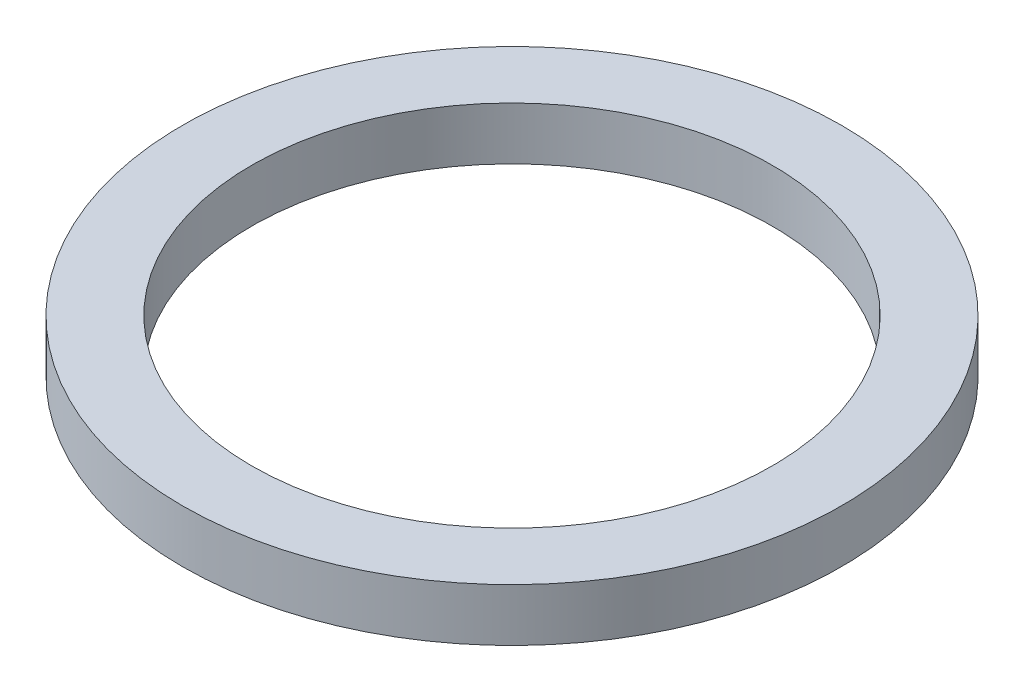
ISO-10303-21;
HEADER;
FILE_DESCRIPTION(('STEP AP214'),'2;1');
FILE_NAME('part.step','',(''),(''),'','','');
FILE_SCHEMA(('AUTOMOTIVE_DESIGN { 1 0 10303 214 1 1 1 1 }'));
ENDSEC;
DATA;
#1=APPLICATION_CONTEXT('core data for automotive mechanical design processes');
#2=APPLICATION_PROTOCOL_DEFINITION('international standard','automotive_design',2000,#1);
#3=PRODUCT_CONTEXT('',#1,'mechanical');
#4=PRODUCT('Part','Part','',(#3));
#5=PRODUCT_RELATED_PRODUCT_CATEGORY('part','',(#4));
#6=PRODUCT_DEFINITION_FORMATION('','',#4);
#7=PRODUCT_DEFINITION_CONTEXT('part definition',#1,'design');
#8=PRODUCT_DEFINITION('design','',#6,#7);
#9=PRODUCT_DEFINITION_SHAPE('','',#8);
#10=(LENGTH_UNIT() NAMED_UNIT(*) SI_UNIT(.MILLI.,.METRE.));
#11=(NAMED_UNIT(*) PLANE_ANGLE_UNIT() SI_UNIT($,.RADIAN.));
#12=(NAMED_UNIT(*) SI_UNIT($,.STERADIAN.) SOLID_ANGLE_UNIT());
#13=UNCERTAINTY_MEASURE_WITH_UNIT(LENGTH_MEASURE(1.E-05),#10,'distance_accuracy_value','');
#14=(GEOMETRIC_REPRESENTATION_CONTEXT(3) GLOBAL_UNCERTAINTY_ASSIGNED_CONTEXT((#13)) GLOBAL_UNIT_ASSIGNED_CONTEXT((#10,
#11,#12)) REPRESENTATION_CONTEXT('',''));
#15=CARTESIAN_POINT('',(0.,0.,0.));
#16=DIRECTION('',(0.,0.,1.));
#17=DIRECTION('',(1.,0.,0.));
#18=AXIS2_PLACEMENT_3D('',#15,#16,#17);
#19=CARTESIAN_POINT('',(0.,0.508,0.));
#20=DIRECTION('',(0.,1.,0.));
#21=DIRECTION('',(0.,0.,1.));
#22=AXIS2_PLACEMENT_3D('',#19,#20,#21);
#23=PLANE('',#22);
#24=CARTESIAN_POINT('',(0.,0.508,0.));
#25=DIRECTION('',(0.,1.,0.));
#26=DIRECTION('',(0.,0.,1.));
#27=AXIS2_PLACEMENT_3D('',#24,#25,#26);
#28=CIRCLE('',#27,3.175);
#29=CARTESIAN_POINT('',(0.,0.508,3.175));
#30=VERTEX_POINT('',#29);
#31=EDGE_CURVE('E10',#30,#30,#28,.T.);
#32=ORIENTED_EDGE('',*,*,#31,.T.);
#33=EDGE_LOOP('',(#32));
#34=FACE_BOUND('',#33,.T.);
#35=CARTESIAN_POINT('',(0.,0.508,0.));
#36=DIRECTION('',(0.,1.,0.));
#37=DIRECTION('',(0.,0.,1.));
#38=AXIS2_PLACEMENT_3D('',#35,#36,#37);
#39=CIRCLE('',#38,2.50825);
#40=CARTESIAN_POINT('',(0.,0.508,2.50825));
#41=VERTEX_POINT('',#40);
#42=EDGE_CURVE('E42',#41,#41,#39,.T.);
#43=ORIENTED_EDGE('',*,*,#42,.F.);
#44=EDGE_LOOP('',(#43));
#45=FACE_BOUND('',#44,.T.);
#46=ADVANCED_FACE('F31',(#34,#45),#23,.T.);
#47=CARTESIAN_POINT('',(0.,0.,0.));
#48=DIRECTION('',(0.,1.,0.));
#49=DIRECTION('',(0.,0.,1.));
#50=AXIS2_PLACEMENT_3D('',#47,#48,#49);
#51=PLANE('',#50);
#52=CARTESIAN_POINT('',(0.,0.,0.));
#53=DIRECTION('',(0.,1.,0.));
#54=DIRECTION('',(0.,0.,1.));
#55=AXIS2_PLACEMENT_3D('',#52,#53,#54);
#56=CIRCLE('',#55,3.175);
#57=CARTESIAN_POINT('',(0.,0.,3.175));
#58=VERTEX_POINT('',#57);
#59=EDGE_CURVE('E35',#58,#58,#56,.T.);
#60=ORIENTED_EDGE('',*,*,#59,.F.);
#61=EDGE_LOOP('',(#60));
#62=FACE_BOUND('',#61,.T.);
#63=CARTESIAN_POINT('',(0.,0.,0.));
#64=DIRECTION('',(0.,1.,0.));
#65=DIRECTION('',(0.,0.,1.));
#66=AXIS2_PLACEMENT_3D('',#63,#64,#65);
#67=CIRCLE('',#66,2.50825);
#68=CARTESIAN_POINT('',(0.,0.,2.50825));
#69=VERTEX_POINT('',#68);
#70=EDGE_CURVE('E44',#69,#69,#67,.T.);
#71=ORIENTED_EDGE('',*,*,#70,.T.);
#72=EDGE_LOOP('',(#71));
#73=FACE_BOUND('',#72,.T.);
#74=ADVANCED_FACE('F54',(#62,#73),#51,.F.);
#75=CARTESIAN_POINT('',(0.,0.508,0.));
#76=DIRECTION('',(0.,-1.,0.));
#77=DIRECTION('',(0.,0.,-1.));
#78=AXIS2_PLACEMENT_3D('',#75,#76,#77);
#79=CYLINDRICAL_SURFACE('',#78,3.175);
#80=ORIENTED_EDGE('',*,*,#31,.F.);
#81=EDGE_LOOP('',(#80));
#82=FACE_BOUND('',#81,.T.);
#83=ORIENTED_EDGE('',*,*,#59,.T.);
#84=EDGE_LOOP('',(#83));
#85=FACE_BOUND('',#84,.T.);
#86=ADVANCED_FACE('F33',(#82,#85),#79,.T.);
#87=CARTESIAN_POINT('',(0.,0.508,0.));
#88=DIRECTION('',(0.,-1.,0.));
#89=DIRECTION('',(0.,0.,-1.));
#90=AXIS2_PLACEMENT_3D('',#87,#88,#89);
#91=CYLINDRICAL_SURFACE('',#90,2.50825);
#92=ORIENTED_EDGE('',*,*,#42,.T.);
#93=EDGE_LOOP('',(#92));
#94=FACE_BOUND('',#93,.T.);
#95=ORIENTED_EDGE('',*,*,#70,.F.);
#96=EDGE_LOOP('',(#95));
#97=FACE_BOUND('',#96,.T.);
#98=ADVANCED_FACE('F50',(#94,#97),#91,.F.);
#99=CLOSED_SHELL('',(#46,#74,#86,#98));
#100=MANIFOLD_SOLID_BREP('B2',#99);
#101=ADVANCED_BREP_SHAPE_REPRESENTATION('',(#18,#100),#14);
#102=SHAPE_DEFINITION_REPRESENTATION(#9,#101);
ENDSEC;
END-ISO-10303-21;
